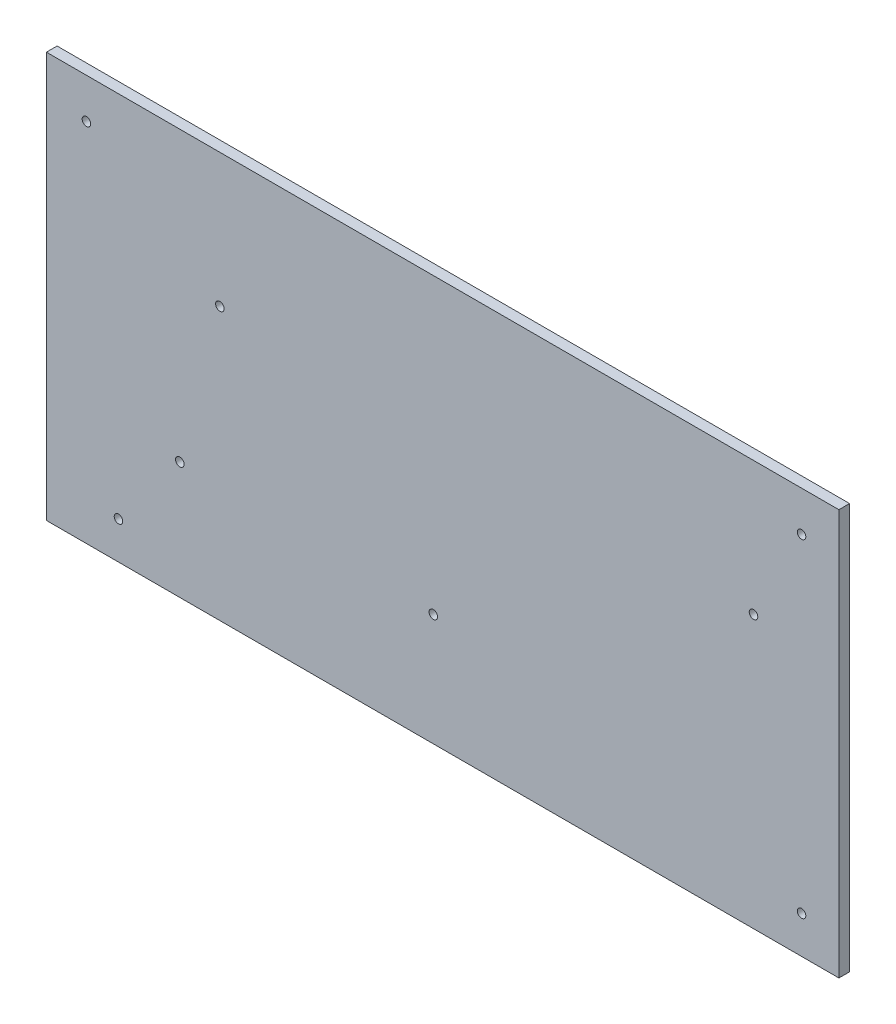
ISO-10303-21;
HEADER;
FILE_DESCRIPTION(('STEP AP214'),'2;1');
FILE_NAME('part.step','',(''),(''),'','','');
FILE_SCHEMA(('AUTOMOTIVE_DESIGN { 1 0 10303 214 1 1 1 1 }'));
ENDSEC;
DATA;
#1=APPLICATION_CONTEXT('core data for automotive mechanical design processes');
#2=APPLICATION_PROTOCOL_DEFINITION('international standard','automotive_design',2000,#1);
#3=PRODUCT_CONTEXT('',#1,'mechanical');
#4=PRODUCT('Part','Part','',(#3));
#5=PRODUCT_RELATED_PRODUCT_CATEGORY('part','',(#4));
#6=PRODUCT_DEFINITION_FORMATION('','',#4);
#7=PRODUCT_DEFINITION_CONTEXT('part definition',#1,'design');
#8=PRODUCT_DEFINITION('design','',#6,#7);
#9=PRODUCT_DEFINITION_SHAPE('','',#8);
#10=(LENGTH_UNIT() NAMED_UNIT(*) SI_UNIT(.MILLI.,.METRE.));
#11=(NAMED_UNIT(*) PLANE_ANGLE_UNIT() SI_UNIT($,.RADIAN.));
#12=(NAMED_UNIT(*) SI_UNIT($,.STERADIAN.) SOLID_ANGLE_UNIT());
#13=UNCERTAINTY_MEASURE_WITH_UNIT(LENGTH_MEASURE(1.E-05),#10,'distance_accuracy_value','');
#14=(GEOMETRIC_REPRESENTATION_CONTEXT(3) GLOBAL_UNCERTAINTY_ASSIGNED_CONTEXT((#13)) GLOBAL_UNIT_ASSIGNED_CONTEXT((#10,
#11,#12)) REPRESENTATION_CONTEXT('',''));
#15=CARTESIAN_POINT('',(0.,0.,0.));
#16=DIRECTION('',(0.,0.,1.));
#17=DIRECTION('',(1.,0.,0.));
#18=AXIS2_PLACEMENT_3D('',#15,#16,#17);
#19=CARTESIAN_POINT('',(0.,0.,2.));
#20=DIRECTION('',(0.,0.,-1.));
#21=DIRECTION('',(-1.,0.,0.));
#22=AXIS2_PLACEMENT_3D('',#19,#20,#21);
#23=PLANE('',#22);
#24=DIRECTION('',(0.,1.,0.));
#25=VECTOR('',#24,1.);
#26=CARTESIAN_POINT('',(152.,-42.,2.));
#27=LINE('',#26,#25);
#28=CARTESIAN_POINT('',(152.,-42.,2.));
#29=VERTEX_POINT('',#28);
#30=CARTESIAN_POINT('',(152.,110.,2.));
#31=VERTEX_POINT('',#30);
#32=EDGE_CURVE('E91',#29,#31,#27,.T.);
#33=ORIENTED_EDGE('',*,*,#32,.T.);
#34=DIRECTION('',(-1.,0.,0.));
#35=VECTOR('',#34,1.);
#36=CARTESIAN_POINT('',(-145.,110.,2.));
#37=LINE('',#36,#35);
#38=CARTESIAN_POINT('',(-145.,110.,2.));
#39=VERTEX_POINT('',#38);
#40=EDGE_CURVE('E86',#31,#39,#37,.T.);
#41=ORIENTED_EDGE('',*,*,#40,.T.);
#42=DIRECTION('',(0.,-1.,0.));
#43=VECTOR('',#42,1.);
#44=CARTESIAN_POINT('',(-145.,-42.,2.));
#45=LINE('',#44,#43);
#46=CARTESIAN_POINT('',(-145.,-42.,2.));
#47=VERTEX_POINT('',#46);
#48=EDGE_CURVE('E93',#39,#47,#45,.T.);
#49=ORIENTED_EDGE('',*,*,#48,.T.);
#50=DIRECTION('',(1.,0.,0.));
#51=VECTOR('',#50,1.);
#52=CARTESIAN_POINT('',(-145.,-42.,2.));
#53=LINE('',#52,#51);
#54=EDGE_CURVE('E59',#47,#29,#53,.T.);
#55=ORIENTED_EDGE('',*,*,#54,.T.);
#56=EDGE_LOOP('',(#33,#41,#49,#55));
#57=FACE_BOUND('',#56,.T.);
#58=CARTESIAN_POINT('',(0.,0.,2.));
#59=DIRECTION('',(0.,0.,1.));
#60=DIRECTION('',(1.,0.,0.));
#61=AXIS2_PLACEMENT_3D('',#58,#59,#60);
#62=CIRCLE('',#61,1.6);
#63=CARTESIAN_POINT('',(1.6,0.,2.));
#64=VERTEX_POINT('',#63);
#65=EDGE_CURVE('E107',#64,#64,#62,.T.);
#66=ORIENTED_EDGE('',*,*,#65,.F.);
#67=EDGE_LOOP('',(#66));
#68=FACE_BOUND('',#67,.T.);
#69=CARTESIAN_POINT('',(-80.,60.,2.));
#70=DIRECTION('',(0.,0.,1.));
#71=DIRECTION('',(1.,0.,0.));
#72=AXIS2_PLACEMENT_3D('',#69,#70,#71);
#73=CIRCLE('',#72,1.6);
#74=CARTESIAN_POINT('',(-78.4,60.,2.));
#75=VERTEX_POINT('',#74);
#76=EDGE_CURVE('E124',#75,#75,#73,.T.);
#77=ORIENTED_EDGE('',*,*,#76,.F.);
#78=EDGE_LOOP('',(#77));
#79=FACE_BOUND('',#78,.T.);
#80=CARTESIAN_POINT('',(120.,60.,2.));
#81=DIRECTION('',(0.,0.,1.));
#82=DIRECTION('',(1.,0.,0.));
#83=AXIS2_PLACEMENT_3D('',#80,#81,#82);
#84=CIRCLE('',#83,1.6);
#85=CARTESIAN_POINT('',(121.6,60.,2.));
#86=VERTEX_POINT('',#85);
#87=EDGE_CURVE('E129',#86,#86,#84,.T.);
#88=ORIENTED_EDGE('',*,*,#87,.F.);
#89=EDGE_LOOP('',(#88));
#90=FACE_BOUND('',#89,.T.);
#91=CARTESIAN_POINT('',(-95.,2.,2.));
#92=DIRECTION('',(0.,0.,1.));
#93=DIRECTION('',(1.,0.,0.));
#94=AXIS2_PLACEMENT_3D('',#91,#92,#93);
#95=CIRCLE('',#94,1.6);
#96=CARTESIAN_POINT('',(-93.4,2.,2.));
#97=VERTEX_POINT('',#96);
#98=EDGE_CURVE('E131',#97,#97,#95,.T.);
#99=ORIENTED_EDGE('',*,*,#98,.F.);
#100=EDGE_LOOP('',(#99));
#101=FACE_BOUND('',#100,.T.);
#102=CARTESIAN_POINT('',(-118.,-28.,2.));
#103=DIRECTION('',(0.,0.,1.));
#104=DIRECTION('',(1.,0.,0.));
#105=AXIS2_PLACEMENT_3D('',#102,#103,#104);
#106=CIRCLE('',#105,1.6);
#107=CARTESIAN_POINT('',(-116.4,-28.,2.));
#108=VERTEX_POINT('',#107);
#109=EDGE_CURVE('E143',#108,#108,#106,.T.);
#110=ORIENTED_EDGE('',*,*,#109,.F.);
#111=EDGE_LOOP('',(#110));
#112=FACE_BOUND('',#111,.T.);
#113=CARTESIAN_POINT('',(138.,-28.,2.));
#114=DIRECTION('',(0.,0.,1.));
#115=DIRECTION('',(1.,0.,0.));
#116=AXIS2_PLACEMENT_3D('',#113,#114,#115);
#117=CIRCLE('',#116,1.59999999999999);
#118=CARTESIAN_POINT('',(139.6,-28.,2.));
#119=VERTEX_POINT('',#118);
#120=EDGE_CURVE('E150',#119,#119,#117,.T.);
#121=ORIENTED_EDGE('',*,*,#120,.F.);
#122=EDGE_LOOP('',(#121));
#123=FACE_BOUND('',#122,.T.);
#124=CARTESIAN_POINT('',(-130.,95.,2.));
#125=DIRECTION('',(0.,0.,1.));
#126=DIRECTION('',(1.,0.,0.));
#127=AXIS2_PLACEMENT_3D('',#124,#125,#126);
#128=CIRCLE('',#127,1.59999999999999);
#129=CARTESIAN_POINT('',(-128.4,95.,2.));
#130=VERTEX_POINT('',#129);
#131=EDGE_CURVE('E153',#130,#130,#128,.T.);
#132=ORIENTED_EDGE('',*,*,#131,.F.);
#133=EDGE_LOOP('',(#132));
#134=FACE_BOUND('',#133,.T.);
#135=CARTESIAN_POINT('',(138.,95.,2.));
#136=DIRECTION('',(0.,0.,1.));
#137=DIRECTION('',(1.,0.,0.));
#138=AXIS2_PLACEMENT_3D('',#135,#136,#137);
#139=CIRCLE('',#138,1.59999999999999);
#140=CARTESIAN_POINT('',(139.6,95.,2.));
#141=VERTEX_POINT('',#140);
#142=EDGE_CURVE('E157',#141,#141,#139,.T.);
#143=ORIENTED_EDGE('',*,*,#142,.F.);
#144=EDGE_LOOP('',(#143));
#145=FACE_BOUND('',#144,.T.);
#146=ADVANCED_FACE('F41',(#57,#68,#79,#90,#101,#112,#123,#134,#145),#23,.F.);
#147=CARTESIAN_POINT('',(0.,0.,-2.));
#148=DIRECTION('',(0.,0.,-1.));
#149=DIRECTION('',(-1.,0.,0.));
#150=AXIS2_PLACEMENT_3D('',#147,#148,#149);
#151=PLANE('',#150);
#152=CARTESIAN_POINT('',(-130.,95.,-2.));
#153=DIRECTION('',(0.,0.,1.));
#154=DIRECTION('',(1.,0.,0.));
#155=AXIS2_PLACEMENT_3D('',#152,#153,#154);
#156=CIRCLE('',#155,1.59999999999999);
#157=CARTESIAN_POINT('',(-128.4,95.,-2.));
#158=VERTEX_POINT('',#157);
#159=EDGE_CURVE('E156',#158,#158,#156,.T.);
#160=ORIENTED_EDGE('',*,*,#159,.T.);
#161=EDGE_LOOP('',(#160));
#162=FACE_BOUND('',#161,.T.);
#163=CARTESIAN_POINT('',(-118.,-28.,-2.));
#164=DIRECTION('',(0.,0.,1.));
#165=DIRECTION('',(1.,0.,0.));
#166=AXIS2_PLACEMENT_3D('',#163,#164,#165);
#167=CIRCLE('',#166,1.6);
#168=CARTESIAN_POINT('',(-116.4,-28.,-2.));
#169=VERTEX_POINT('',#168);
#170=EDGE_CURVE('E145',#169,#169,#167,.T.);
#171=ORIENTED_EDGE('',*,*,#170,.T.);
#172=EDGE_LOOP('',(#171));
#173=FACE_BOUND('',#172,.T.);
#174=CARTESIAN_POINT('',(120.,60.,-2.));
#175=DIRECTION('',(0.,0.,1.));
#176=DIRECTION('',(1.,0.,0.));
#177=AXIS2_PLACEMENT_3D('',#174,#175,#176);
#178=CIRCLE('',#177,1.6);
#179=CARTESIAN_POINT('',(121.6,60.,-2.));
#180=VERTEX_POINT('',#179);
#181=EDGE_CURVE('E134',#180,#180,#178,.T.);
#182=ORIENTED_EDGE('',*,*,#181,.T.);
#183=EDGE_LOOP('',(#182));
#184=FACE_BOUND('',#183,.T.);
#185=CARTESIAN_POINT('',(0.,0.,-2.));
#186=DIRECTION('',(0.,0.,1.));
#187=DIRECTION('',(1.,0.,0.));
#188=AXIS2_PLACEMENT_3D('',#185,#186,#187);
#189=CIRCLE('',#188,1.6);
#190=CARTESIAN_POINT('',(1.6,0.,-2.));
#191=VERTEX_POINT('',#190);
#192=EDGE_CURVE('E116',#191,#191,#189,.T.);
#193=ORIENTED_EDGE('',*,*,#192,.T.);
#194=EDGE_LOOP('',(#193));
#195=FACE_BOUND('',#194,.T.);
#196=DIRECTION('',(0.,1.,0.));
#197=VECTOR('',#196,1.);
#198=CARTESIAN_POINT('',(152.,-42.,-2.));
#199=LINE('',#198,#197);
#200=CARTESIAN_POINT('',(152.,-42.,-2.));
#201=VERTEX_POINT('',#200);
#202=CARTESIAN_POINT('',(152.,110.,-2.));
#203=VERTEX_POINT('',#202);
#204=EDGE_CURVE('E104',#201,#203,#199,.T.);
#205=ORIENTED_EDGE('',*,*,#204,.F.);
#206=DIRECTION('',(1.,0.,0.));
#207=VECTOR('',#206,1.);
#208=CARTESIAN_POINT('',(-145.,-42.,-2.));
#209=LINE('',#208,#207);
#210=CARTESIAN_POINT('',(-145.,-42.,-2.));
#211=VERTEX_POINT('',#210);
#212=EDGE_CURVE('E81',#211,#201,#209,.T.);
#213=ORIENTED_EDGE('',*,*,#212,.F.);
#214=DIRECTION('',(0.,-1.,0.));
#215=VECTOR('',#214,1.);
#216=CARTESIAN_POINT('',(-145.,-42.,-2.));
#217=LINE('',#216,#215);
#218=CARTESIAN_POINT('',(-145.,110.,-2.));
#219=VERTEX_POINT('',#218);
#220=EDGE_CURVE('E73',#219,#211,#217,.T.);
#221=ORIENTED_EDGE('',*,*,#220,.F.);
#222=DIRECTION('',(-1.,0.,0.));
#223=VECTOR('',#222,1.);
#224=CARTESIAN_POINT('',(-145.,110.,-2.));
#225=LINE('',#224,#223);
#226=EDGE_CURVE('E100',#203,#219,#225,.T.);
#227=ORIENTED_EDGE('',*,*,#226,.F.);
#228=EDGE_LOOP('',(#205,#213,#221,#227));
#229=FACE_BOUND('',#228,.T.);
#230=CARTESIAN_POINT('',(-80.,60.,-2.));
#231=DIRECTION('',(0.,0.,1.));
#232=DIRECTION('',(1.,0.,0.));
#233=AXIS2_PLACEMENT_3D('',#230,#231,#232);
#234=CIRCLE('',#233,1.6);
#235=CARTESIAN_POINT('',(-78.4,60.,-2.));
#236=VERTEX_POINT('',#235);
#237=EDGE_CURVE('E127',#236,#236,#234,.T.);
#238=ORIENTED_EDGE('',*,*,#237,.T.);
#239=EDGE_LOOP('',(#238));
#240=FACE_BOUND('',#239,.T.);
#241=CARTESIAN_POINT('',(-95.,2.,-2.));
#242=DIRECTION('',(0.,0.,1.));
#243=DIRECTION('',(1.,0.,0.));
#244=AXIS2_PLACEMENT_3D('',#241,#242,#243);
#245=CIRCLE('',#244,1.6);
#246=CARTESIAN_POINT('',(-93.4,2.,-2.));
#247=VERTEX_POINT('',#246);
#248=EDGE_CURVE('E139',#247,#247,#245,.T.);
#249=ORIENTED_EDGE('',*,*,#248,.T.);
#250=EDGE_LOOP('',(#249));
#251=FACE_BOUND('',#250,.T.);
#252=CARTESIAN_POINT('',(138.,-28.,-2.));
#253=DIRECTION('',(0.,0.,1.));
#254=DIRECTION('',(1.,0.,0.));
#255=AXIS2_PLACEMENT_3D('',#252,#253,#254);
#256=CIRCLE('',#255,1.59999999999999);
#257=CARTESIAN_POINT('',(139.6,-28.,-2.));
#258=VERTEX_POINT('',#257);
#259=EDGE_CURVE('E147',#258,#258,#256,.T.);
#260=ORIENTED_EDGE('',*,*,#259,.T.);
#261=EDGE_LOOP('',(#260));
#262=FACE_BOUND('',#261,.T.);
#263=CARTESIAN_POINT('',(138.,95.,-2.));
#264=DIRECTION('',(0.,0.,1.));
#265=DIRECTION('',(1.,0.,0.));
#266=AXIS2_PLACEMENT_3D('',#263,#264,#265);
#267=CIRCLE('',#266,1.59999999999999);
#268=CARTESIAN_POINT('',(139.6,95.,-2.));
#269=VERTEX_POINT('',#268);
#270=EDGE_CURVE('E165',#269,#269,#267,.T.);
#271=ORIENTED_EDGE('',*,*,#270,.T.);
#272=EDGE_LOOP('',(#271));
#273=FACE_BOUND('',#272,.T.);
#274=ADVANCED_FACE('F118',(#162,#173,#184,#195,#229,#240,#251,#262,#273),#151,.T.);
#275=CARTESIAN_POINT('',(152.,-42.,2.));
#276=DIRECTION('',(-1.,0.,0.));
#277=DIRECTION('',(0.,0.,1.));
#278=AXIS2_PLACEMENT_3D('',#275,#276,#277);
#279=PLANE('',#278);
#280=ORIENTED_EDGE('',*,*,#204,.T.);
#281=DIRECTION('',(0.,0.,-1.));
#282=VECTOR('',#281,1.);
#283=CARTESIAN_POINT('',(152.,110.,2.));
#284=LINE('',#283,#282);
#285=EDGE_CURVE('E11',#31,#203,#284,.T.);
#286=ORIENTED_EDGE('',*,*,#285,.F.);
#287=ORIENTED_EDGE('',*,*,#32,.F.);
#288=DIRECTION('',(0.,0.,-1.));
#289=VECTOR('',#288,1.);
#290=CARTESIAN_POINT('',(152.,-42.,2.));
#291=LINE('',#290,#289);
#292=EDGE_CURVE('E101',#29,#201,#291,.T.);
#293=ORIENTED_EDGE('',*,*,#292,.T.);
#294=EDGE_LOOP('',(#280,#286,#287,#293));
#295=FACE_BOUND('',#294,.T.);
#296=ADVANCED_FACE('F43',(#295),#279,.F.);
#297=CARTESIAN_POINT('',(-145.,110.,2.));
#298=DIRECTION('',(0.,-1.,0.));
#299=DIRECTION('',(0.,0.,-1.));
#300=AXIS2_PLACEMENT_3D('',#297,#298,#299);
#301=PLANE('',#300);
#302=ORIENTED_EDGE('',*,*,#226,.T.);
#303=DIRECTION('',(0.,0.,-1.));
#304=VECTOR('',#303,1.);
#305=CARTESIAN_POINT('',(-145.,110.,2.));
#306=LINE('',#305,#304);
#307=EDGE_CURVE('E49',#39,#219,#306,.T.);
#308=ORIENTED_EDGE('',*,*,#307,.F.);
#309=ORIENTED_EDGE('',*,*,#40,.F.);
#310=ORIENTED_EDGE('',*,*,#285,.T.);
#311=EDGE_LOOP('',(#302,#308,#309,#310));
#312=FACE_BOUND('',#311,.T.);
#313=ADVANCED_FACE('F96',(#312),#301,.F.);
#314=CARTESIAN_POINT('',(-145.,-42.,2.));
#315=DIRECTION('',(1.,0.,0.));
#316=DIRECTION('',(0.,0.,-1.));
#317=AXIS2_PLACEMENT_3D('',#314,#315,#316);
#318=PLANE('',#317);
#319=ORIENTED_EDGE('',*,*,#220,.T.);
#320=DIRECTION('',(0.,0.,-1.));
#321=VECTOR('',#320,1.);
#322=CARTESIAN_POINT('',(-145.,-42.,2.));
#323=LINE('',#322,#321);
#324=EDGE_CURVE('E98',#47,#211,#323,.T.);
#325=ORIENTED_EDGE('',*,*,#324,.F.);
#326=ORIENTED_EDGE('',*,*,#48,.F.);
#327=ORIENTED_EDGE('',*,*,#307,.T.);
#328=EDGE_LOOP('',(#319,#325,#326,#327));
#329=FACE_BOUND('',#328,.T.);
#330=ADVANCED_FACE('F97',(#329),#318,.F.);
#331=CARTESIAN_POINT('',(-145.,-42.,2.));
#332=DIRECTION('',(0.,1.,0.));
#333=DIRECTION('',(0.,0.,1.));
#334=AXIS2_PLACEMENT_3D('',#331,#332,#333);
#335=PLANE('',#334);
#336=ORIENTED_EDGE('',*,*,#212,.T.);
#337=ORIENTED_EDGE('',*,*,#292,.F.);
#338=ORIENTED_EDGE('',*,*,#54,.F.);
#339=ORIENTED_EDGE('',*,*,#324,.T.);
#340=EDGE_LOOP('',(#336,#337,#338,#339));
#341=FACE_BOUND('',#340,.T.);
#342=ADVANCED_FACE('F114',(#341),#335,.F.);
#343=CARTESIAN_POINT('',(0.,0.,2.));
#344=DIRECTION('',(0.,0.,-1.));
#345=DIRECTION('',(-1.,0.,0.));
#346=AXIS2_PLACEMENT_3D('',#343,#344,#345);
#347=CYLINDRICAL_SURFACE('',#346,1.6);
#348=ORIENTED_EDGE('',*,*,#65,.T.);
#349=EDGE_LOOP('',(#348));
#350=FACE_BOUND('',#349,.T.);
#351=ORIENTED_EDGE('',*,*,#192,.F.);
#352=EDGE_LOOP('',(#351));
#353=FACE_BOUND('',#352,.T.);
#354=ADVANCED_FACE('F178',(#350,#353),#347,.F.);
#355=CARTESIAN_POINT('',(-80.,60.,2.));
#356=DIRECTION('',(0.,0.,-1.));
#357=DIRECTION('',(-1.,0.,0.));
#358=AXIS2_PLACEMENT_3D('',#355,#356,#357);
#359=CYLINDRICAL_SURFACE('',#358,1.6);
#360=ORIENTED_EDGE('',*,*,#76,.T.);
#361=EDGE_LOOP('',(#360));
#362=FACE_BOUND('',#361,.T.);
#363=ORIENTED_EDGE('',*,*,#237,.F.);
#364=EDGE_LOOP('',(#363));
#365=FACE_BOUND('',#364,.T.);
#366=ADVANCED_FACE('F221',(#362,#365),#359,.F.);
#367=CARTESIAN_POINT('',(120.,60.,2.));
#368=DIRECTION('',(0.,0.,-1.));
#369=DIRECTION('',(-1.,0.,0.));
#370=AXIS2_PLACEMENT_3D('',#367,#368,#369);
#371=CYLINDRICAL_SURFACE('',#370,1.6);
#372=ORIENTED_EDGE('',*,*,#87,.T.);
#373=EDGE_LOOP('',(#372));
#374=FACE_BOUND('',#373,.T.);
#375=ORIENTED_EDGE('',*,*,#181,.F.);
#376=EDGE_LOOP('',(#375));
#377=FACE_BOUND('',#376,.T.);
#378=ADVANCED_FACE('F232',(#374,#377),#371,.F.);
#379=CARTESIAN_POINT('',(-95.,2.,2.));
#380=DIRECTION('',(0.,0.,-1.));
#381=DIRECTION('',(-1.,0.,0.));
#382=AXIS2_PLACEMENT_3D('',#379,#380,#381);
#383=CYLINDRICAL_SURFACE('',#382,1.6);
#384=ORIENTED_EDGE('',*,*,#98,.T.);
#385=EDGE_LOOP('',(#384));
#386=FACE_BOUND('',#385,.T.);
#387=ORIENTED_EDGE('',*,*,#248,.F.);
#388=EDGE_LOOP('',(#387));
#389=FACE_BOUND('',#388,.T.);
#390=ADVANCED_FACE('F238',(#386,#389),#383,.F.);
#391=CARTESIAN_POINT('',(-118.,-28.,2.));
#392=DIRECTION('',(0.,0.,-1.));
#393=DIRECTION('',(-1.,0.,0.));
#394=AXIS2_PLACEMENT_3D('',#391,#392,#393);
#395=CYLINDRICAL_SURFACE('',#394,1.6);
#396=ORIENTED_EDGE('',*,*,#109,.T.);
#397=EDGE_LOOP('',(#396));
#398=FACE_BOUND('',#397,.T.);
#399=ORIENTED_EDGE('',*,*,#170,.F.);
#400=EDGE_LOOP('',(#399));
#401=FACE_BOUND('',#400,.T.);
#402=ADVANCED_FACE('F248',(#398,#401),#395,.F.);
#403=CARTESIAN_POINT('',(138.,-28.,2.));
#404=DIRECTION('',(0.,0.,-1.));
#405=DIRECTION('',(-1.,0.,0.));
#406=AXIS2_PLACEMENT_3D('',#403,#404,#405);
#407=CYLINDRICAL_SURFACE('',#406,1.59999999999999);
#408=ORIENTED_EDGE('',*,*,#120,.T.);
#409=EDGE_LOOP('',(#408));
#410=FACE_BOUND('',#409,.T.);
#411=ORIENTED_EDGE('',*,*,#259,.F.);
#412=EDGE_LOOP('',(#411));
#413=FACE_BOUND('',#412,.T.);
#414=ADVANCED_FACE('F256',(#410,#413),#407,.F.);
#415=CARTESIAN_POINT('',(-130.,95.,2.));
#416=DIRECTION('',(0.,0.,-1.));
#417=DIRECTION('',(-1.,0.,0.));
#418=AXIS2_PLACEMENT_3D('',#415,#416,#417);
#419=CYLINDRICAL_SURFACE('',#418,1.59999999999999);
#420=ORIENTED_EDGE('',*,*,#131,.T.);
#421=EDGE_LOOP('',(#420));
#422=FACE_BOUND('',#421,.T.);
#423=ORIENTED_EDGE('',*,*,#159,.F.);
#424=EDGE_LOOP('',(#423));
#425=FACE_BOUND('',#424,.T.);
#426=ADVANCED_FACE('F270',(#422,#425),#419,.F.);
#427=CARTESIAN_POINT('',(138.,95.,2.));
#428=DIRECTION('',(0.,0.,-1.));
#429=DIRECTION('',(-1.,0.,0.));
#430=AXIS2_PLACEMENT_3D('',#427,#428,#429);
#431=CYLINDRICAL_SURFACE('',#430,1.59999999999999);
#432=ORIENTED_EDGE('',*,*,#142,.T.);
#433=EDGE_LOOP('',(#432));
#434=FACE_BOUND('',#433,.T.);
#435=ORIENTED_EDGE('',*,*,#270,.F.);
#436=EDGE_LOOP('',(#435));
#437=FACE_BOUND('',#436,.T.);
#438=ADVANCED_FACE('F169',(#434,#437),#431,.F.);
#439=CLOSED_SHELL('',(#146,#274,#296,#313,#330,#342,#354,#366,#378,#390,#402,#414,#426,#438));
#440=MANIFOLD_SOLID_BREP('B2',#439);
#441=ADVANCED_BREP_SHAPE_REPRESENTATION('',(#18,#440),#14);
#442=SHAPE_DEFINITION_REPRESENTATION(#9,#441);
ENDSEC;
END-ISO-10303-21;
